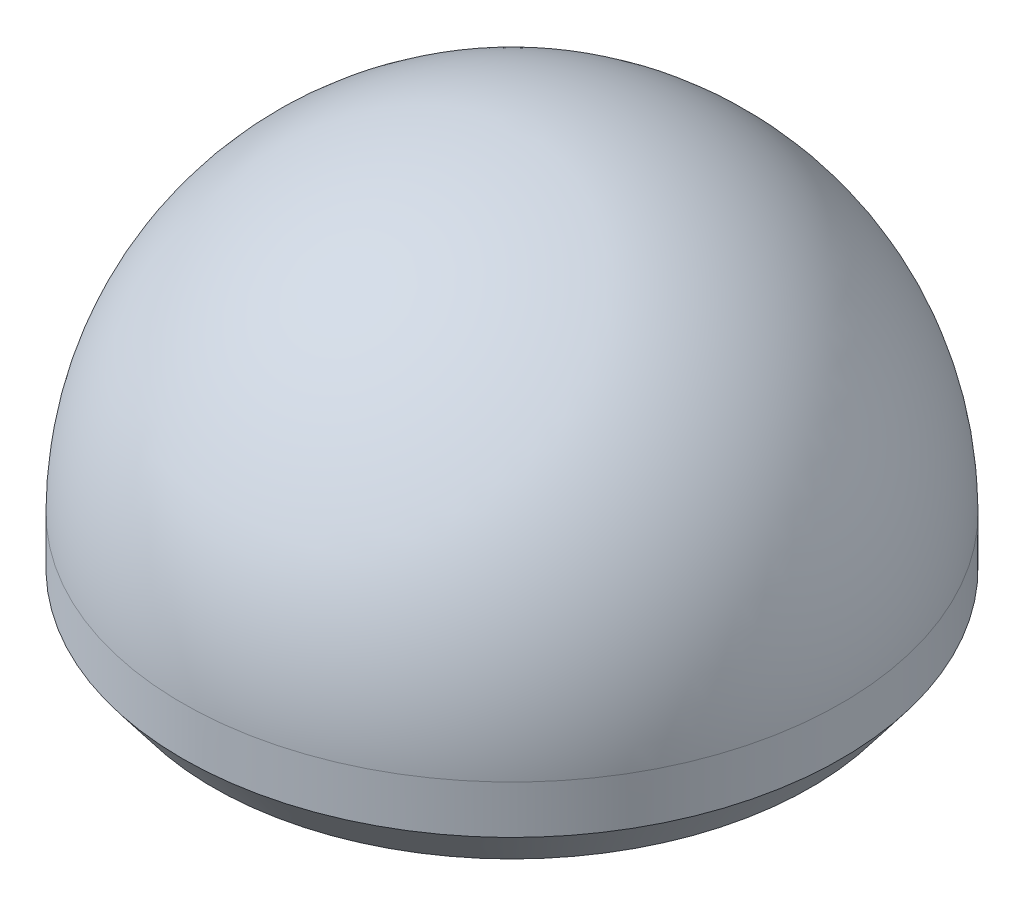
ISO-10303-21;
HEADER;
FILE_DESCRIPTION(('STEP AP214'),'2;1');
FILE_NAME('part.step','',(''),(''),'','','');
FILE_SCHEMA(('AUTOMOTIVE_DESIGN { 1 0 10303 214 1 1 1 1 }'));
ENDSEC;
DATA;
#1=APPLICATION_CONTEXT('core data for automotive mechanical design processes');
#2=APPLICATION_PROTOCOL_DEFINITION('international standard','automotive_design',2000,#1);
#3=PRODUCT_CONTEXT('',#1,'mechanical');
#4=PRODUCT('Part','Part','',(#3));
#5=PRODUCT_RELATED_PRODUCT_CATEGORY('part','',(#4));
#6=PRODUCT_DEFINITION_FORMATION('','',#4);
#7=PRODUCT_DEFINITION_CONTEXT('part definition',#1,'design');
#8=PRODUCT_DEFINITION('design','',#6,#7);
#9=PRODUCT_DEFINITION_SHAPE('','',#8);
#10=(LENGTH_UNIT() NAMED_UNIT(*) SI_UNIT(.MILLI.,.METRE.));
#11=(NAMED_UNIT(*) PLANE_ANGLE_UNIT() SI_UNIT($,.RADIAN.));
#12=(NAMED_UNIT(*) SI_UNIT($,.STERADIAN.) SOLID_ANGLE_UNIT());
#13=UNCERTAINTY_MEASURE_WITH_UNIT(LENGTH_MEASURE(1.E-05),#10,'distance_accuracy_value','');
#14=(GEOMETRIC_REPRESENTATION_CONTEXT(3) GLOBAL_UNCERTAINTY_ASSIGNED_CONTEXT((#13)) GLOBAL_UNIT_ASSIGNED_CONTEXT((#10,
#11,#12)) REPRESENTATION_CONTEXT('',''));
#15=CARTESIAN_POINT('',(0.,0.,0.));
#16=DIRECTION('',(0.,0.,1.));
#17=DIRECTION('',(1.,0.,0.));
#18=AXIS2_PLACEMENT_3D('',#15,#16,#17);
#19=CARTESIAN_POINT('',(0.,-250.,0.));
#20=DIRECTION('',(0.,-1.,0.));
#21=DIRECTION('',(-1.,0.,0.));
#22=AXIS2_PLACEMENT_3D('',#19,#20,#21);
#23=SPHERICAL_SURFACE('',#22,250.);
#24=CARTESIAN_POINT('',(8.93406167306175E-13,-15.6189751616687,85.3077165179603));
#25=DIRECTION('',(0.,0.939692620785908,0.34202014332567));
#26=DIRECTION('',(0.,-0.34202014332567,0.939692620785908));
#27=AXIS2_PLACEMENT_3D('',#24,#25,#26);
#28=CIRCLE('',#27,16.9743541327755);
#29=CARTESIAN_POINT('',(8.93406167306175E-13,-21.4245461950213,101.258391839136));
#30=VERTEX_POINT('',#29);
#31=EDGE_CURVE('E36',#30,#30,#28,.T.);
#32=ORIENTED_EDGE('',*,*,#31,.T.);
#33=EDGE_LOOP('',(#32));
#34=FACE_BOUND('',#33,.T.);
#35=CARTESIAN_POINT('',(-85.3077165179603,-15.6189751616687,0.));
#36=DIRECTION('',(-0.34202014332567,0.939692620785908,0.));
#37=DIRECTION('',(-0.939692620785908,-0.34202014332567,0.));
#38=AXIS2_PLACEMENT_3D('',#35,#36,#37);
#39=CIRCLE('',#38,16.9743541327755);
#40=CARTESIAN_POINT('',(-101.258391839136,-21.4245461950213,0.));
#41=VERTEX_POINT('',#40);
#42=EDGE_CURVE('E54',#41,#41,#39,.T.);
#43=ORIENTED_EDGE('',*,*,#42,.T.);
#44=EDGE_LOOP('',(#43));
#45=FACE_BOUND('',#44,.T.);
#46=CARTESIAN_POINT('',(-2.97995033820939E-13,-15.6189751616687,-85.3077165179603));
#47=DIRECTION('',(0.,0.939692620785908,-0.34202014332567));
#48=DIRECTION('',(0.,0.34202014332567,0.939692620785908));
#49=AXIS2_PLACEMENT_3D('',#46,#47,#48);
#50=CIRCLE('',#49,16.9743541327755);
#51=CARTESIAN_POINT('',(-2.97995033820939E-13,-9.81340412831617,-69.3570411967844));
#52=VERTEX_POINT('',#51);
#53=EDGE_CURVE('E52',#52,#52,#50,.T.);
#54=ORIENTED_EDGE('',*,*,#53,.T.);
#55=EDGE_LOOP('',(#54));
#56=FACE_BOUND('',#55,.T.);
#57=CARTESIAN_POINT('',(85.3077165179603,-15.6189751616687,0.));
#58=DIRECTION('',(0.34202014332567,0.939692620785908,0.));
#59=DIRECTION('',(-0.939692620785908,0.34202014332567,0.));
#60=AXIS2_PLACEMENT_3D('',#57,#58,#59);
#61=CIRCLE('',#60,16.9743541327755);
#62=CARTESIAN_POINT('',(69.3570411967844,-9.81340412831617,0.));
#63=VERTEX_POINT('',#62);
#64=EDGE_CURVE('E49',#63,#63,#61,.T.);
#65=ORIENTED_EDGE('',*,*,#64,.T.);
#66=EDGE_LOOP('',(#65));
#67=FACE_BOUND('',#66,.T.);
#68=CARTESIAN_POINT('',(0.,-40.2238733998715,0.));
#69=DIRECTION('',(0.,-1.,0.));
#70=DIRECTION('',(0.,0.,-1.));
#71=AXIS2_PLACEMENT_3D('',#68,#69,#70);
#72=CIRCLE('',#71,135.99256122541);
#73=CARTESIAN_POINT('',(0.,-40.2238733998715,-135.99256122541));
#74=VERTEX_POINT('',#73);
#75=EDGE_CURVE('E45',#74,#74,#72,.T.);
#76=ORIENTED_EDGE('',*,*,#75,.T.);
#77=EDGE_LOOP('',(#76));
#78=FACE_BOUND('',#77,.T.);
#79=ADVANCED_FACE('F33',(#34,#45,#56,#67,#78),#23,.F.);
#80=CARTESIAN_POINT('',(0.,0.,0.));
#81=DIRECTION('',(0.,-1.,0.));
#82=DIRECTION('',(-1.,0.,0.));
#83=AXIS2_PLACEMENT_3D('',#80,#81,#82);
#84=SPHERICAL_SURFACE('',#83,150.);
#85=CARTESIAN_POINT('',(0.,0.,0.));
#86=DIRECTION('',(0.,-1.,0.));
#87=DIRECTION('',(0.,0.,-1.));
#88=AXIS2_PLACEMENT_3D('',#85,#86,#87);
#89=CIRCLE('',#88,150.);
#90=CARTESIAN_POINT('',(0.,0.,-150.));
#91=VERTEX_POINT('',#90);
#92=EDGE_CURVE('E10',#91,#91,#89,.T.);
#93=ORIENTED_EDGE('',*,*,#92,.F.);
#94=EDGE_LOOP('',(#93));
#95=FACE_BOUND('',#94,.T.);
#96=ADVANCED_FACE('F73',(#95),#84,.T.);
#97=CARTESIAN_POINT('',(0.,0.,0.));
#98=DIRECTION('',(0.,-1.,0.));
#99=DIRECTION('',(0.,0.,-1.));
#100=AXIS2_PLACEMENT_3D('',#97,#98,#99);
#101=CYLINDRICAL_SURFACE('',#100,150.);
#102=CARTESIAN_POINT('',(0.,-21.8396887176898,0.));
#103=DIRECTION('',(0.,-1.,0.));
#104=DIRECTION('',(0.,0.,-1.));
#105=AXIS2_PLACEMENT_3D('',#102,#103,#104);
#106=CIRCLE('',#105,150.);
#107=CARTESIAN_POINT('',(0.,-21.8396887176898,-150.));
#108=VERTEX_POINT('',#107);
#109=EDGE_CURVE('E40',#108,#108,#106,.T.);
#110=ORIENTED_EDGE('',*,*,#109,.F.);
#111=EDGE_LOOP('',(#110));
#112=FACE_BOUND('',#111,.T.);
#113=ORIENTED_EDGE('',*,*,#92,.T.);
#114=EDGE_LOOP('',(#113));
#115=FACE_BOUND('',#114,.T.);
#116=ADVANCED_FACE('F77',(#112,#115),#101,.T.);
#117=CARTESIAN_POINT('',(0.,-21.8396887176898,0.));
#118=DIRECTION('',(0.,1.,0.));
#119=DIRECTION('',(0.,0.,1.));
#120=AXIS2_PLACEMENT_3D('',#117,#118,#119);
#121=CONICAL_SURFACE('',#120,150.,0.651091896059841);
#122=ORIENTED_EDGE('',*,*,#75,.F.);
#123=EDGE_LOOP('',(#122));
#124=FACE_BOUND('',#123,.T.);
#125=ORIENTED_EDGE('',*,*,#109,.T.);
#126=EDGE_LOOP('',(#125));
#127=FACE_BOUND('',#126,.T.);
#128=ADVANCED_FACE('F82',(#124,#127),#121,.T.);
#129=CARTESIAN_POINT('',(88.9252372646741,-5.67991859566389,0.));
#130=DIRECTION('',(0.,-1.,0.));
#131=DIRECTION('',(-1.,0.,0.));
#132=AXIS2_PLACEMENT_3D('',#129,#130,#131);
#133=SPHERICAL_SURFACE('',#132,20.);
#134=CARTESIAN_POINT('',(88.9252372646741,-5.67991859566389,0.));
#135=DIRECTION('',(0.34202014332567,0.939692620785908,0.));
#136=DIRECTION('',(-0.939692620785908,0.34202014332567,0.));
#137=AXIS2_PLACEMENT_3D('',#134,#135,#136);
#138=SPHERICAL_SURFACE('',#137,20.);
#139=ORIENTED_EDGE('',*,*,#64,.F.);
#140=EDGE_LOOP('',(#139));
#141=FACE_BOUND('',#140,.T.);
#142=ADVANCED_FACE('F88',(#141),#138,.F.);
#143=CARTESIAN_POINT('',(-3.10480806461808E-13,-5.67991859566389,-88.9252372646741));
#144=DIRECTION('',(0.,-1.,0.));
#145=DIRECTION('',(0.,0.,1.));
#146=AXIS2_PLACEMENT_3D('',#143,#144,#145);
#147=SPHERICAL_SURFACE('',#146,20.);
#148=CARTESIAN_POINT('',(-3.10480806461808E-13,-5.67991859566389,-88.9252372646741));
#149=DIRECTION('',(0.,0.939692620785908,-0.34202014332567));
#150=DIRECTION('',(0.,0.34202014332567,0.939692620785908));
#151=AXIS2_PLACEMENT_3D('',#148,#149,#150);
#152=SPHERICAL_SURFACE('',#151,20.);
#153=ORIENTED_EDGE('',*,*,#53,.F.);
#154=EDGE_LOOP('',(#153));
#155=FACE_BOUND('',#154,.T.);
#156=ADVANCED_FACE('F69',(#155),#152,.F.);
#157=CARTESIAN_POINT('',(-88.9252372646741,-5.67991859566389,0.));
#158=DIRECTION('',(0.,-1.,0.));
#159=DIRECTION('',(1.,0.,0.));
#160=AXIS2_PLACEMENT_3D('',#157,#158,#159);
#161=SPHERICAL_SURFACE('',#160,20.);
#162=CARTESIAN_POINT('',(-88.9252372646741,-5.67991859566389,0.));
#163=DIRECTION('',(-0.34202014332567,0.939692620785908,0.));
#164=DIRECTION('',(-0.939692620785908,-0.34202014332567,0.));
#165=AXIS2_PLACEMENT_3D('',#162,#163,#164);
#166=SPHERICAL_SURFACE('',#165,20.);
#167=ORIENTED_EDGE('',*,*,#42,.F.);
#168=EDGE_LOOP('',(#167));
#169=FACE_BOUND('',#168,.T.);
#170=ADVANCED_FACE('F64',(#169),#166,.F.);
#171=CARTESIAN_POINT('',(9.31442419385423E-13,-5.67991859566389,88.9252372646741));
#172=DIRECTION('',(0.,-1.,0.));
#173=DIRECTION('',(0.,0.,-1.));
#174=AXIS2_PLACEMENT_3D('',#171,#172,#173);
#175=SPHERICAL_SURFACE('',#174,20.);
#176=CARTESIAN_POINT('',(9.31442419385423E-13,-5.67991859566389,88.9252372646741));
#177=DIRECTION('',(0.,0.939692620785908,0.34202014332567));
#178=DIRECTION('',(0.,-0.34202014332567,0.939692620785908));
#179=AXIS2_PLACEMENT_3D('',#176,#177,#178);
#180=SPHERICAL_SURFACE('',#179,20.);
#181=ORIENTED_EDGE('',*,*,#31,.F.);
#182=EDGE_LOOP('',(#181));
#183=FACE_BOUND('',#182,.T.);
#184=ADVANCED_FACE('F62',(#183),#180,.F.);
#185=CLOSED_SHELL('',(#79,#96,#116,#128,#142,#156,#170,#184));
#186=MANIFOLD_SOLID_BREP('B2',#185);
#187=ADVANCED_BREP_SHAPE_REPRESENTATION('',(#18,#186),#14);
#188=SHAPE_DEFINITION_REPRESENTATION(#9,#187);
ENDSEC;
END-ISO-10303-21;
